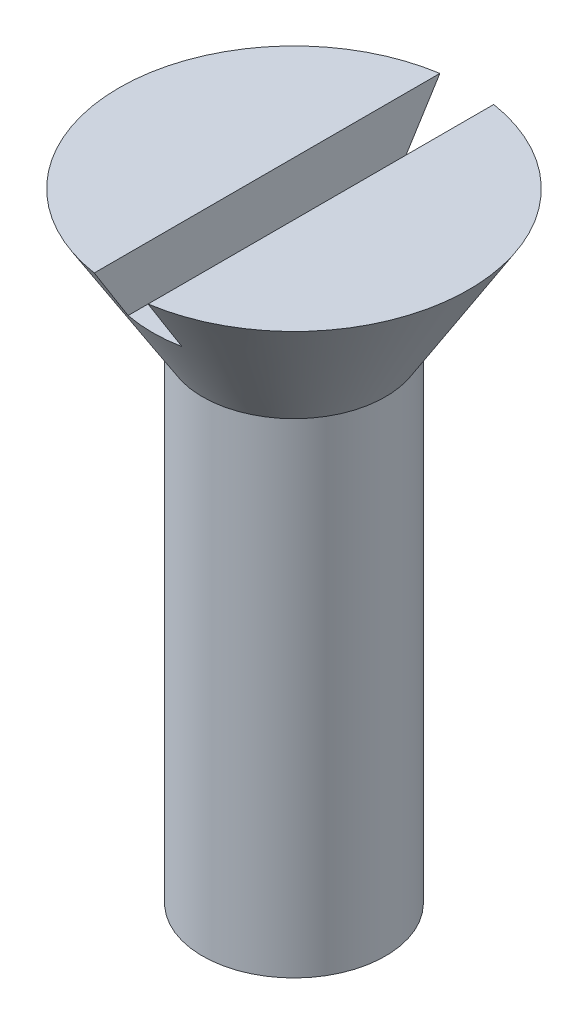
ISO-10303-21;
HEADER;
FILE_DESCRIPTION(('STEP AP214'),'2;1');
FILE_NAME('part.step','',(''),(''),'','','');
FILE_SCHEMA(('AUTOMOTIVE_DESIGN { 1 0 10303 214 1 1 1 1 }'));
ENDSEC;
DATA;
#1=APPLICATION_CONTEXT('core data for automotive mechanical design processes');
#2=APPLICATION_PROTOCOL_DEFINITION('international standard','automotive_design',2000,#1);
#3=PRODUCT_CONTEXT('',#1,'mechanical');
#4=PRODUCT('Part','Part','',(#3));
#5=PRODUCT_RELATED_PRODUCT_CATEGORY('part','',(#4));
#6=PRODUCT_DEFINITION_FORMATION('','',#4);
#7=PRODUCT_DEFINITION_CONTEXT('part definition',#1,'design');
#8=PRODUCT_DEFINITION('design','',#6,#7);
#9=PRODUCT_DEFINITION_SHAPE('','',#8);
#10=(LENGTH_UNIT() NAMED_UNIT(*) SI_UNIT(.MILLI.,.METRE.));
#11=(NAMED_UNIT(*) PLANE_ANGLE_UNIT() SI_UNIT($,.RADIAN.));
#12=(NAMED_UNIT(*) SI_UNIT($,.STERADIAN.) SOLID_ANGLE_UNIT());
#13=UNCERTAINTY_MEASURE_WITH_UNIT(LENGTH_MEASURE(1.E-05),#10,'distance_accuracy_value','');
#14=(GEOMETRIC_REPRESENTATION_CONTEXT(3) GLOBAL_UNCERTAINTY_ASSIGNED_CONTEXT((#13)) GLOBAL_UNIT_ASSIGNED_CONTEXT((#10,
#11,#12)) REPRESENTATION_CONTEXT('',''));
#15=CARTESIAN_POINT('',(0.,0.,0.));
#16=DIRECTION('',(0.,0.,1.));
#17=DIRECTION('',(1.,0.,0.));
#18=AXIS2_PLACEMENT_3D('',#15,#16,#17);
#19=CARTESIAN_POINT('',(-6.5,0.,0.));
#20=DIRECTION('',(0.,1.,0.));
#21=DIRECTION('',(-1.,0.,0.));
#22=AXIS2_PLACEMENT_3D('',#19,#20,#21);
#23=PLANE('',#22);
#24=DIRECTION('',(0.,0.,1.));
#25=VECTOR('',#24,1.);
#26=CARTESIAN_POINT('',(1.,0.,-6.5));
#27=LINE('',#26,#25);
#28=CARTESIAN_POINT('',(1.,0.,-6.42261628933256));
#29=VERTEX_POINT('',#28);
#30=CARTESIAN_POINT('',(1.,0.,6.42261628933256));
#31=VERTEX_POINT('',#30);
#32=EDGE_CURVE('E102',#29,#31,#27,.T.);
#33=ORIENTED_EDGE('',*,*,#32,.T.);
#34=CARTESIAN_POINT('',(0.,0.,0.));
#35=DIRECTION('',(0.,1.,0.));
#36=DIRECTION('',(-1.,0.,0.));
#37=AXIS2_PLACEMENT_3D('',#34,#35,#36);
#38=CIRCLE('',#37,6.5);
#39=EDGE_CURVE('E109',#31,#29,#38,.T.);
#40=ORIENTED_EDGE('',*,*,#39,.T.);
#41=EDGE_LOOP('',(#33,#40));
#42=FACE_BOUND('',#41,.T.);
#43=ADVANCED_FACE('F39',(#42),#23,.T.);
#44=DIRECTION('',(0.,0.,1.));
#45=VECTOR('',#44,1.);
#46=CARTESIAN_POINT('',(-1.,0.,-6.5));
#47=LINE('',#46,#45);
#48=CARTESIAN_POINT('',(-1.,0.,-6.42261628933256));
#49=VERTEX_POINT('',#48);
#50=CARTESIAN_POINT('',(-1.,0.,6.42261628933256));
#51=VERTEX_POINT('',#50);
#52=EDGE_CURVE('E88',#49,#51,#47,.T.);
#53=ORIENTED_EDGE('',*,*,#52,.F.);
#54=EDGE_CURVE('E100',#49,#51,#38,.T.);
#55=ORIENTED_EDGE('',*,*,#54,.T.);
#56=EDGE_LOOP('',(#53,#55));
#57=FACE_BOUND('',#56,.T.);
#58=ADVANCED_FACE('F41',(#57),#23,.T.);
#59=CARTESIAN_POINT('',(0.,-23.,0.));
#60=DIRECTION('',(0.,1.,0.));
#61=DIRECTION('',(-1.,0.,0.));
#62=AXIS2_PLACEMENT_3D('',#59,#60,#61);
#63=CONICAL_SURFACE('',#62,3.4,1.0471975511966);
#64=CARTESIAN_POINT('',(0.,-24.9629909152447,0.));
#65=VERTEX_POINT('',#64);
#66=VERTEX_LOOP('',#65);
#67=FACE_BOUND('',#66,.T.);
#68=CARTESIAN_POINT('',(0.,-23.,0.));
#69=DIRECTION('',(0.,1.,0.));
#70=DIRECTION('',(-1.,0.,0.));
#71=AXIS2_PLACEMENT_3D('',#68,#69,#70);
#72=CIRCLE('',#71,3.4);
#73=CARTESIAN_POINT('',(-3.4,-23.,0.));
#74=VERTEX_POINT('',#73);
#75=EDGE_CURVE('E95',#74,#74,#72,.T.);
#76=ORIENTED_EDGE('',*,*,#75,.F.);
#77=EDGE_LOOP('',(#76));
#78=FACE_BOUND('',#77,.T.);
#79=ADVANCED_FACE('F151',(#67,#78),#63,.T.);
#80=CARTESIAN_POINT('',(0.,0.,0.));
#81=DIRECTION('',(0.,1.,0.));
#82=DIRECTION('',(-1.,0.,0.));
#83=AXIS2_PLACEMENT_3D('',#80,#81,#82);
#84=CYLINDRICAL_SURFACE('',#83,3.4);
#85=ORIENTED_EDGE('',*,*,#75,.T.);
#86=EDGE_LOOP('',(#85));
#87=FACE_BOUND('',#86,.T.);
#88=CARTESIAN_POINT('',(0.,-5.,0.));
#89=DIRECTION('',(0.,1.,0.));
#90=DIRECTION('',(-1.,0.,0.));
#91=AXIS2_PLACEMENT_3D('',#88,#89,#90);
#92=CIRCLE('',#91,3.4);
#93=CARTESIAN_POINT('',(-3.4,-5.,0.));
#94=VERTEX_POINT('',#93);
#95=EDGE_CURVE('E115',#94,#94,#92,.T.);
#96=ORIENTED_EDGE('',*,*,#95,.F.);
#97=EDGE_LOOP('',(#96));
#98=FACE_BOUND('',#97,.T.);
#99=ADVANCED_FACE('F145',(#87,#98),#84,.T.);
#100=CARTESIAN_POINT('',(0.,0.,0.));
#101=DIRECTION('',(0.,1.,0.));
#102=DIRECTION('',(-1.,0.,0.));
#103=AXIS2_PLACEMENT_3D('',#100,#101,#102);
#104=CONICAL_SURFACE('',#103,6.5,0.554995727338587);
#105=CARTESIAN_POINT('',(1.,0.00069999999999911,-6.4230555180814));
#106=CARTESIAN_POINT('',(1.,-0.283812842301866,-6.24452448491495));
#107=CARTESIAN_POINT('',(1.,-0.568253336202722,-6.06587788680683));
#108=CARTESIAN_POINT('',(1.,-1.13693421955463,-5.70824980389053));
#109=CARTESIAN_POINT('',(1.,-1.42117460349842,-5.52926831032613));
#110=CARTESIAN_POINT('',(1.,-1.98990873930945,-5.17054564568944));
#111=CARTESIAN_POINT('',(1.,-2.27440199162623,-4.99080368233799));
#112=CARTESIAN_POINT('',(1.,-2.8430078008153,-4.63073342801186));
#113=CARTESIAN_POINT('',(1.,-3.12712036673624,-4.45040515133553));
#114=CARTESIAN_POINT('',(1.,-3.72620352735658,-4.06892336920752));
#115=CARTESIAN_POINT('',(1.,-4.04111198100567,-3.86767223828635));
#116=CARTESIAN_POINT('',(1.,-4.66993618516007,-3.46356795854043));
#117=CARTESIAN_POINT('',(1.,-4.9838518585773,-3.26071468939093));
#118=CARTESIAN_POINT('',(1.,-5.45316155751587,-2.95455459884838));
#119=CARTESIAN_POINT('',(1.,-5.60921956123384,-2.85226626630781));
#120=CARTESIAN_POINT('',(1.,-5.9207225321686,-2.64676111282955));
#121=CARTESIAN_POINT('',(1.,-6.07616750380666,-2.54354429860589));
#122=CARTESIAN_POINT('',(1.,-6.38616742109424,-2.33582502243256));
#123=CARTESIAN_POINT('',(1.,-6.54072248087025,-2.23132273098424));
#124=CARTESIAN_POINT('',(1.,-6.84853687672436,-2.0204296449391));
#125=CARTESIAN_POINT('',(1.,-7.00179626909944,-1.91403893302356));
#126=CARTESIAN_POINT('',(1.,-7.21875382978126,-1.76027519054519));
#127=CARTESIAN_POINT('',(1.,-7.28331267507717,-1.71411731898743));
#128=CARTESIAN_POINT('',(1.,-7.41194760772256,-1.62112534507116));
#129=CARTESIAN_POINT('',(1.,-7.47602366931129,-1.57429120701135));
#130=CARTESIAN_POINT('',(1.,-7.60371084171874,-1.47966064700344));
#131=CARTESIAN_POINT('',(1.,-7.66732039021567,-1.4318621125509));
#132=CARTESIAN_POINT('',(1.,-7.79370093962828,-1.33518229831408));
#133=CARTESIAN_POINT('',(1.,-7.85647205043569,-1.28630116270062));
#134=CARTESIAN_POINT('',(1.,-7.9798698766511,-1.18791363893101));
#135=CARTESIAN_POINT('',(1.,-8.04051485945983,-1.13843024545839));
#136=CARTESIAN_POINT('',(1.,-8.1602429141053,-1.03761172397383));
#137=CARTESIAN_POINT('',(1.,-8.21932624371379,-0.986276904914121));
#138=CARTESIAN_POINT('',(1.,-8.33496867084971,-0.881219015395868));
#139=CARTESIAN_POINT('',(1.,-8.39153581323294,-0.827504846635604));
#140=CARTESIAN_POINT('',(1.,-8.5009905879137,-0.716476194499409));
#141=CARTESIAN_POINT('',(1.,-8.55388299763922,-0.659166577313897));
#142=CARTESIAN_POINT('',(1.,-8.62040763975987,-0.578898721664465));
#143=CARTESIAN_POINT('',(1.,-8.63686747639703,-0.55829231884693));
#144=CARTESIAN_POINT('',(1.,-8.66887011620208,-0.516375084272969));
#145=CARTESIAN_POINT('',(1.,-8.68441267834614,-0.495064069647037));
#146=CARTESIAN_POINT('',(1.,-8.72933718965041,-0.42997226221721));
#147=CARTESIAN_POINT('',(1.,-8.75705507471443,-0.384987019506434));
#148=CARTESIAN_POINT('',(1.,-8.80073198517891,-0.300432964140931));
#149=CARTESIAN_POINT('',(1.,-8.81792999458379,-0.261518242627592));
#150=CARTESIAN_POINT('',(1.,-8.84584617624064,-0.181407715513724));
#151=CARTESIAN_POINT('',(1.,-8.85657744559897,-0.140216706170007));
#152=CARTESIAN_POINT('',(1.,-8.8688032909693,-0.0627623730593633));
#153=CARTESIAN_POINT('',(1.,-8.87143972411515,-0.0266839932978724));
#154=CARTESIAN_POINT('',(1.,-8.87035509541175,0.0453616518003186));
#155=CARTESIAN_POINT('',(1.,-8.86663591939623,0.0813289469257923));
#156=CARTESIAN_POINT('',(1.,-8.85184758449829,0.16041543779174));
#157=CARTESIAN_POINT('',(1.,-8.83926558166298,0.203244613572831));
#158=CARTESIAN_POINT('',(1.,-8.8074226071984,0.286347751342272));
#159=CARTESIAN_POINT('',(1.,-8.78814245926853,0.326613979887365));
#160=CARTESIAN_POINT('',(1.,-8.74099220095225,0.411762859213281));
#161=CARTESIAN_POINT('',(1.,-8.71219223920798,0.456117374936295));
#162=CARTESIAN_POINT('',(1.,-8.65043655122718,0.541873405595243));
#163=CARTESIAN_POINT('',(1.,-8.6174726925936,0.583268886626098));
#164=CARTESIAN_POINT('',(1.,-8.54857640592402,0.664001191721987));
#165=CARTESIAN_POINT('',(1.,-8.51262413010682,0.703320852375567));
#166=CARTESIAN_POINT('',(1.,-8.43886249517736,0.780083983406266));
#167=CARTESIAN_POINT('',(1.,-8.4010549703017,0.817529235793721));
#168=CARTESIAN_POINT('',(1.,-8.32057129175893,0.894354442510429));
#169=CARTESIAN_POINT('',(1.,-8.27776602389127,0.933598326121807));
#170=CARTESIAN_POINT('',(1.,-8.19098805507183,1.01077786753254));
#171=CARTESIAN_POINT('',(1.,-8.14701518109674,1.04871332950515));
#172=CARTESIAN_POINT('',(1.,-8.01376143261411,1.16102985295729));
#173=CARTESIAN_POINT('',(1.,-7.92319182936232,1.23387815309161));
#174=CARTESIAN_POINT('',(1.,-7.73980996633858,1.37708314596361));
#175=CARTESIAN_POINT('',(1.,-7.64699320203289,1.44743399077955));
#176=CARTESIAN_POINT('',(1.,-7.46002801374113,1.58627486236479));
#177=CARTESIAN_POINT('',(1.,-7.36588002783992,1.65476548058854));
#178=CARTESIAN_POINT('',(1.,-7.1767091260652,1.79037993520878));
#179=CARTESIAN_POINT('',(1.,-7.08168687486704,1.85750470247562));
#180=CARTESIAN_POINT('',(1.,-6.89094942431198,1.99077669323983));
#181=CARTESIAN_POINT('',(1.,-6.79523417096726,2.05692383932854));
#182=CARTESIAN_POINT('',(1.,-6.50758191653455,2.25407670792361));
#183=CARTESIAN_POINT('',(1.,-6.31488550630835,2.38397301023405));
#184=CARTESIAN_POINT('',(1.,-5.86838351729328,2.68191207899586));
#185=CARTESIAN_POINT('',(1.,-5.61414470027593,2.84930267740829));
#186=CARTESIAN_POINT('',(1.,-5.10444707665037,3.18222518567622));
#187=CARTESIAN_POINT('',(1.,-4.84898823954291,3.34775704871487));
#188=CARTESIAN_POINT('',(1.,-4.33713578577915,3.67771279350563));
#189=CARTESIAN_POINT('',(1.,-4.0807416928961,3.84213593554862));
#190=CARTESIAN_POINT('',(1.,-3.56742824644271,4.17015385533531));
#191=CARTESIAN_POINT('',(1.,-3.31050889815853,4.33374864135852));
#192=CARTESIAN_POINT('',(1.,-2.79932211174414,4.65842516748705));
#193=CARTESIAN_POINT('',(1.,-2.5450590612919,4.8195138193844));
#194=CARTESIAN_POINT('',(1.,-2.03626160778433,5.14126375358609));
#195=CARTESIAN_POINT('',(1.,-1.78172720382668,5.30192503446307));
#196=CARTESIAN_POINT('',(1.,-1.27263397058029,5.62280894089958));
#197=CARTESIAN_POINT('',(1.,-1.01807528627549,5.78303179654925));
#198=CARTESIAN_POINT('',(1.,-0.508797507008255,6.1032198359545));
#199=CARTESIAN_POINT('',(1.,-0.254078412776181,6.26318502087166));
#200=CARTESIAN_POINT('',(1.,0.000699999999999248,6.42305551808141));
#201=B_SPLINE_CURVE_WITH_KNOTS('',3,(#105,#106,#107,#108,#109,#110,#111,#112,#113,#114,#115,
#116,#117,#118,#119,#120,#121,#122,#123,#124,#125,#126,#127,#128,#129,#130,#131,#132,#133,#134,
#135,#136,#137,#138,#139,#140,#141,#142,#143,#144,#145,#146,#147,#148,#149,#150,#151,#152,#153,
#154,#155,#156,#157,#158,#159,#160,#161,#162,#163,#164,#165,#166,#167,#168,#169,#170,#171,#172,
#173,#174,#175,#176,#177,#178,#179,#180,#181,#182,#183,#184,#185,#186,#187,#188,#189,#190,#191,
#192,#193,#194,#195,#196,#197,#198,#199,#200),.UNSPECIFIED.,.F.,.F.,(4,2,2,2,2,2,2,2,2,2,2,2,2,
2,2,2,2,2,2,2,2,2,2,2,2,2,2,2,2,2,2,2,2,2,2,2,2,2,2,2,2,2,2,2,2,2,2,4),(0.,1.00766480927834,
2.01535634389507,3.02490637618046,4.0344319706467,5.15560073844196,6.2768545251471,
6.83663180766047,7.39640504556283,7.95610482089284,8.51578015086816,8.75386415768871,
8.99196077967009,9.23065248235443,9.46931258717075,9.70410237777675,9.93885316805042,
10.1727896854189,10.4064161449183,10.4855122153969,10.5646289775311,10.7226827073015,
10.8499194638207,10.9768976536488,11.0848753684445,11.1928210496998,11.3259605251294,
11.4594843537845,11.6177627523153,11.7763552035558,11.9361011645735,12.0956922517399,
12.2698727698926,12.4440792448805,12.7926815516878,13.1420524940118,13.4913110225472,
13.8403229579064,14.1893623817784,14.8865115437167,15.7996870682818,16.7128855420689,
17.6266426324385,18.5403905716149,19.4433813092064,20.3463750588764,21.2487292499661,
22.1510793618476),.UNSPECIFIED.);
#202=CARTESIAN_POINT('',(1.,-2.,5.16406816376391));
#203=VERTEX_POINT('',#202);
#204=EDGE_CURVE('E11',#203,#31,#201,.T.);
#205=ORIENTED_EDGE('',*,*,#204,.F.);
#206=CARTESIAN_POINT('',(0.,-2.,0.));
#207=DIRECTION('',(0.,-1.,0.));
#208=DIRECTION('',(0.,0.,-1.));
#209=AXIS2_PLACEMENT_3D('',#206,#207,#208);
#210=CIRCLE('',#209,5.26);
#211=CARTESIAN_POINT('',(-1.,-2.,5.16406816376391));
#212=VERTEX_POINT('',#211);
#213=EDGE_CURVE('E55',#212,#203,#210,.F.);
#214=ORIENTED_EDGE('',*,*,#213,.F.);
#215=CARTESIAN_POINT('',(-1.,0.000699999999997959,6.4230555180814));
#216=CARTESIAN_POINT('',(-1.,-0.283812842301867,6.24452448491495));
#217=CARTESIAN_POINT('',(-1.,-0.568253336202721,6.06587788680683));
#218=CARTESIAN_POINT('',(-1.,-1.13693421955463,5.70824980389053));
#219=CARTESIAN_POINT('',(-1.,-1.42117460349842,5.52926831032613));
#220=CARTESIAN_POINT('',(-1.,-1.98990873930945,5.17054564568945));
#221=CARTESIAN_POINT('',(-1.,-2.27440199162622,4.990803682338));
#222=CARTESIAN_POINT('',(-1.,-2.84300780081529,4.63073342801187));
#223=CARTESIAN_POINT('',(-1.,-3.12712036673623,4.45040515133553));
#224=CARTESIAN_POINT('',(-1.,-3.72620352735658,4.06892336920753));
#225=CARTESIAN_POINT('',(-1.,-4.04111198100566,3.86767223828636));
#226=CARTESIAN_POINT('',(-1.,-4.66993618516007,3.46356795854043));
#227=CARTESIAN_POINT('',(-0.999999999999999,-4.9838518585773,3.26071468939094));
#228=CARTESIAN_POINT('',(-0.999999999999999,-5.45316155751587,2.95455459884838));
#229=CARTESIAN_POINT('',(-0.999999999999999,-5.60921956123384,2.85226626630782));
#230=CARTESIAN_POINT('',(-0.999999999999999,-5.9207225321686,2.64676111282955));
#231=CARTESIAN_POINT('',(-0.999999999999999,-6.07616750380666,2.54354429860589));
#232=CARTESIAN_POINT('',(-0.999999999999999,-6.38616742109425,2.33582502243256));
#233=CARTESIAN_POINT('',(-0.999999999999999,-6.54072248087026,2.23132273098424));
#234=CARTESIAN_POINT('',(-0.999999999999999,-6.84853687672437,2.0204296449391));
#235=CARTESIAN_POINT('',(-0.999999999999999,-7.00179626909945,1.91403893302356));
#236=CARTESIAN_POINT('',(-0.999999999999999,-7.21875382978127,1.76027519054519));
#237=CARTESIAN_POINT('',(-0.999999999999999,-7.28331267507717,1.71411731898743));
#238=CARTESIAN_POINT('',(-0.999999999999999,-7.41194760772256,1.62112534507116));
#239=CARTESIAN_POINT('',(-0.999999999999999,-7.47602366931129,1.57429120701134));
#240=CARTESIAN_POINT('',(-0.999999999999999,-7.60371084171874,1.47966064700343));
#241=CARTESIAN_POINT('',(-0.999999999999999,-7.66732039021567,1.4318621125509));
#242=CARTESIAN_POINT('',(-0.999999999999999,-7.79370093962828,1.33518229831407));
#243=CARTESIAN_POINT('',(-0.999999999999999,-7.85647205043569,1.28630116270062));
#244=CARTESIAN_POINT('',(-0.999999999999999,-7.97986987665111,1.18791363893101));
#245=CARTESIAN_POINT('',(-0.999999999999999,-8.04051485945983,1.13843024545839));
#246=CARTESIAN_POINT('',(-0.999999999999999,-8.1602429141053,1.03761172397383));
#247=CARTESIAN_POINT('',(-0.999999999999999,-8.2193262437138,0.986276904914122));
#248=CARTESIAN_POINT('',(-0.999999999999999,-8.33496867084971,0.881219015395869));
#249=CARTESIAN_POINT('',(-0.999999999999999,-8.39153581323295,0.827504846635605));
#250=CARTESIAN_POINT('',(-0.999999999999999,-8.5009905879137,0.71647619449941));
#251=CARTESIAN_POINT('',(-0.999999999999999,-8.55388299763922,0.659166577313899));
#252=CARTESIAN_POINT('',(-0.999999999999999,-8.62040763975988,0.578898721664468));
#253=CARTESIAN_POINT('',(-0.999999999999999,-8.63686747639704,0.558292318846933));
#254=CARTESIAN_POINT('',(-0.999999999999999,-8.66887011620208,0.516375084272971));
#255=CARTESIAN_POINT('',(-0.999999999999999,-8.68441267834614,0.495064069647039));
#256=CARTESIAN_POINT('',(-0.999999999999999,-8.72933718965042,0.429972262217213));
#257=CARTESIAN_POINT('',(-0.999999999999999,-8.75705507471443,0.384987019506437));
#258=CARTESIAN_POINT('',(-0.999999999999999,-8.80073198517891,0.300432964140935));
#259=CARTESIAN_POINT('',(-0.999999999999999,-8.8179299945838,0.261518242627595));
#260=CARTESIAN_POINT('',(-0.999999999999999,-8.84584617624065,0.181407715513728));
#261=CARTESIAN_POINT('',(-0.999999999999999,-8.85657744559897,0.140216706170011));
#262=CARTESIAN_POINT('',(-0.999999999999999,-8.86880329096931,0.0627623730593669));
#263=CARTESIAN_POINT('',(-0.999999999999999,-8.87143972411516,0.0266839932978758));
#264=CARTESIAN_POINT('',(-0.999999999999999,-8.87035509541175,-0.0453616518003151));
#265=CARTESIAN_POINT('',(-0.999999999999999,-8.86663591939624,-0.0813289469257886));
#266=CARTESIAN_POINT('',(-0.999999999999999,-8.8518475844983,-0.160415437791736));
#267=CARTESIAN_POINT('',(-0.999999999999999,-8.83926558166299,-0.203244613572828));
#268=CARTESIAN_POINT('',(-0.999999999999999,-8.80742260719841,-0.286347751342268));
#269=CARTESIAN_POINT('',(-0.999999999999999,-8.78814245926854,-0.326613979887359));
#270=CARTESIAN_POINT('',(-0.999999999999999,-8.74099220095226,-0.411762859213275));
#271=CARTESIAN_POINT('',(-0.999999999999999,-8.71219223920799,-0.45611737493629));
#272=CARTESIAN_POINT('',(-0.999999999999999,-8.65043655122719,-0.541873405595236));
#273=CARTESIAN_POINT('',(-0.999999999999999,-8.61747269259361,-0.58326888662609));
#274=CARTESIAN_POINT('',(-0.999999999999999,-8.54857640592403,-0.664001191721978));
#275=CARTESIAN_POINT('',(-0.999999999999999,-8.51262413010683,-0.703320852375558));
#276=CARTESIAN_POINT('',(-0.999999999999999,-8.43886249517737,-0.780083983406256));
#277=CARTESIAN_POINT('',(-0.999999999999999,-8.40105497030171,-0.817529235793709));
#278=CARTESIAN_POINT('',(-0.999999999999999,-8.32057129175895,-0.894354442510415));
#279=CARTESIAN_POINT('',(-0.999999999999999,-8.27776602389129,-0.933598326121793));
#280=CARTESIAN_POINT('',(-0.999999999999999,-8.19098805507185,-1.01077786753252));
#281=CARTESIAN_POINT('',(-0.999999999999999,-8.14701518109677,-1.04871332950513));
#282=CARTESIAN_POINT('',(-0.999999999999999,-8.01376143261414,-1.16102985295727));
#283=CARTESIAN_POINT('',(-0.999999999999999,-7.92319182936235,-1.23387815309159));
#284=CARTESIAN_POINT('',(-0.999999999999999,-7.73980996633861,-1.37708314596359));
#285=CARTESIAN_POINT('',(-0.999999999999999,-7.64699320203293,-1.44743399077952));
#286=CARTESIAN_POINT('',(-0.999999999999999,-7.46002801374117,-1.58627486236477));
#287=CARTESIAN_POINT('',(-0.999999999999999,-7.36588002783997,-1.65476548058851));
#288=CARTESIAN_POINT('',(-0.999999999999999,-7.17670912606524,-1.79037993520875));
#289=CARTESIAN_POINT('',(-0.999999999999999,-7.08168687486709,-1.85750470247559));
#290=CARTESIAN_POINT('',(-0.999999999999999,-6.89094942431203,-1.9907766932398));
#291=CARTESIAN_POINT('',(-0.999999999999999,-6.79523417096732,-2.0569238393285));
#292=CARTESIAN_POINT('',(-0.999999999999999,-6.50758191653461,-2.25407670792357));
#293=CARTESIAN_POINT('',(-0.999999999999999,-6.31488550630841,-2.38397301023401));
#294=CARTESIAN_POINT('',(-0.999999999999999,-5.86838351729335,-2.68191207899582));
#295=CARTESIAN_POINT('',(-0.999999999999999,-5.61414470027599,-2.84930267740825));
#296=CARTESIAN_POINT('',(-0.999999999999999,-5.10444707665043,-3.18222518567618));
#297=CARTESIAN_POINT('',(-1.,-4.84898823954296,-3.34775704871484));
#298=CARTESIAN_POINT('',(-1.,-4.3371357857792,-3.6777127935056));
#299=CARTESIAN_POINT('',(-1.,-4.08074169289614,-3.84213593554859));
#300=CARTESIAN_POINT('',(-1.,-3.56742824644275,-4.17015385533529));
#301=CARTESIAN_POINT('',(-1.,-3.31050889815856,-4.3337486413585));
#302=CARTESIAN_POINT('',(-1.,-2.79932211174417,-4.65842516748703));
#303=CARTESIAN_POINT('',(-1.,-2.54505906129192,-4.81951381938438));
#304=CARTESIAN_POINT('',(-1.,-2.03626160778435,-5.14126375358607));
#305=CARTESIAN_POINT('',(-1.,-1.7817272038267,-5.30192503446305));
#306=CARTESIAN_POINT('',(-1.,-1.27263397058031,-5.62280894089957));
#307=CARTESIAN_POINT('',(-1.,-1.0180752862755,-5.78303179654924));
#308=CARTESIAN_POINT('',(-1.,-0.508797507008261,-6.1032198359545));
#309=CARTESIAN_POINT('',(-1.,-0.254078412776184,-6.26318502087166));
#310=CARTESIAN_POINT('',(-1.,0.000699999999999193,-6.4230555180814));
#311=B_SPLINE_CURVE_WITH_KNOTS('',3,(#215,#216,#217,#218,#219,#220,#221,#222,#223,#224,#225,
#226,#227,#228,#229,#230,#231,#232,#233,#234,#235,#236,#237,#238,#239,#240,#241,#242,#243,#244,
#245,#246,#247,#248,#249,#250,#251,#252,#253,#254,#255,#256,#257,#258,#259,#260,#261,#262,#263,
#264,#265,#266,#267,#268,#269,#270,#271,#272,#273,#274,#275,#276,#277,#278,#279,#280,#281,#282,
#283,#284,#285,#286,#287,#288,#289,#290,#291,#292,#293,#294,#295,#296,#297,#298,#299,#300,#301,
#302,#303,#304,#305,#306,#307,#308,#309,#310),.UNSPECIFIED.,.F.,.F.,(4,2,2,2,2,2,2,2,2,2,2,2,2,
2,2,2,2,2,2,2,2,2,2,2,2,2,2,2,2,2,2,2,2,2,2,2,2,2,2,2,2,2,2,2,2,2,2,4),(0.,1.00766480927834,
2.01535634389506,3.02490637618045,4.03443197064669,5.15560073844195,6.2768545251471,
6.83663180766047,7.39640504556283,7.95610482089284,8.51578015086816,8.75386415768872,
8.99196077967009,9.23065248235443,9.46931258717075,9.70410237777676,9.93885316805042,
10.1727896854189,10.4064161449183,10.4855122153969,10.5646289775311,10.7226827073015,
10.8499194638207,10.9768976536488,11.0848753684445,11.1928210496998,11.3259605251294,
11.4594843537845,11.6177627523153,11.7763552035558,11.9361011645734,12.0956922517399,
12.2698727698926,12.4440792448804,12.7926815516878,13.1420524940118,13.4913110225472,
13.8403229579063,14.1893623817784,14.8865115437166,15.7996870682818,16.7128855420688,
17.6266426324385,18.5403905716148,19.4433813092064,20.3463750588764,21.2487292499661,
22.1510793618476),.UNSPECIFIED.);
#312=EDGE_CURVE('E97',#51,#212,#311,.T.);
#313=ORIENTED_EDGE('',*,*,#312,.F.);
#314=ORIENTED_EDGE('',*,*,#54,.F.);
#315=CARTESIAN_POINT('',(-1.,-2.,-5.16406816376391));
#316=VERTEX_POINT('',#315);
#317=EDGE_CURVE('E85',#316,#49,#311,.T.);
#318=ORIENTED_EDGE('',*,*,#317,.F.);
#319=CARTESIAN_POINT('',(1.,-2.,-5.16406816376391));
#320=VERTEX_POINT('',#319);
#321=EDGE_CURVE('E94',#320,#316,#210,.F.);
#322=ORIENTED_EDGE('',*,*,#321,.F.);
#323=EDGE_CURVE('E43',#29,#320,#201,.T.);
#324=ORIENTED_EDGE('',*,*,#323,.F.);
#325=ORIENTED_EDGE('',*,*,#39,.F.);
#326=EDGE_LOOP('',(#205,#214,#313,#314,#318,#322,#324,#325));
#327=FACE_BOUND('',#326,.T.);
#328=ORIENTED_EDGE('',*,*,#95,.T.);
#329=EDGE_LOOP('',(#328));
#330=FACE_BOUND('',#329,.T.);
#331=ADVANCED_FACE('F105',(#327,#330),#104,.T.);
#332=CARTESIAN_POINT('',(1.,-2.,-6.5));
#333=DIRECTION('',(1.,0.,0.));
#334=DIRECTION('',(0.,0.,-1.));
#335=AXIS2_PLACEMENT_3D('',#332,#333,#334);
#336=PLANE('',#335);
#337=ORIENTED_EDGE('',*,*,#323,.T.);
#338=DIRECTION('',(0.,0.,1.));
#339=VECTOR('',#338,1.);
#340=CARTESIAN_POINT('',(1.,-2.,-6.5));
#341=LINE('',#340,#339);
#342=EDGE_CURVE('E110',#320,#203,#341,.T.);
#343=ORIENTED_EDGE('',*,*,#342,.T.);
#344=ORIENTED_EDGE('',*,*,#204,.T.);
#345=ORIENTED_EDGE('',*,*,#32,.F.);
#346=EDGE_LOOP('',(#337,#343,#344,#345));
#347=FACE_BOUND('',#346,.T.);
#348=ADVANCED_FACE('F136',(#347),#336,.F.);
#349=CARTESIAN_POINT('',(-1.,-2.,-6.5));
#350=DIRECTION('',(0.,-1.,0.));
#351=DIRECTION('',(0.,0.,-1.));
#352=AXIS2_PLACEMENT_3D('',#349,#350,#351);
#353=PLANE('',#352);
#354=ORIENTED_EDGE('',*,*,#213,.T.);
#355=ORIENTED_EDGE('',*,*,#342,.F.);
#356=ORIENTED_EDGE('',*,*,#321,.T.);
#357=DIRECTION('',(0.,0.,1.));
#358=VECTOR('',#357,1.);
#359=CARTESIAN_POINT('',(-1.,-2.,-6.5));
#360=LINE('',#359,#358);
#361=EDGE_CURVE('E62',#316,#212,#360,.T.);
#362=ORIENTED_EDGE('',*,*,#361,.T.);
#363=EDGE_LOOP('',(#354,#355,#356,#362));
#364=FACE_BOUND('',#363,.T.);
#365=ADVANCED_FACE('F135',(#364),#353,.F.);
#366=CARTESIAN_POINT('',(-1.,0.,-6.5));
#367=DIRECTION('',(-1.,0.,0.));
#368=DIRECTION('',(0.,-1.,0.));
#369=AXIS2_PLACEMENT_3D('',#366,#367,#368);
#370=PLANE('',#369);
#371=ORIENTED_EDGE('',*,*,#312,.T.);
#372=ORIENTED_EDGE('',*,*,#361,.F.);
#373=ORIENTED_EDGE('',*,*,#317,.T.);
#374=ORIENTED_EDGE('',*,*,#52,.T.);
#375=EDGE_LOOP('',(#371,#372,#373,#374));
#376=FACE_BOUND('',#375,.T.);
#377=ADVANCED_FACE('F87',(#376),#370,.F.);
#378=CLOSED_SHELL('',(#43,#58,#79,#99,#331,#348,#365,#377));
#379=MANIFOLD_SOLID_BREP('B2',#378);
#380=ADVANCED_BREP_SHAPE_REPRESENTATION('',(#18,#379),#14);
#381=SHAPE_DEFINITION_REPRESENTATION(#9,#380);
ENDSEC;
END-ISO-10303-21;
